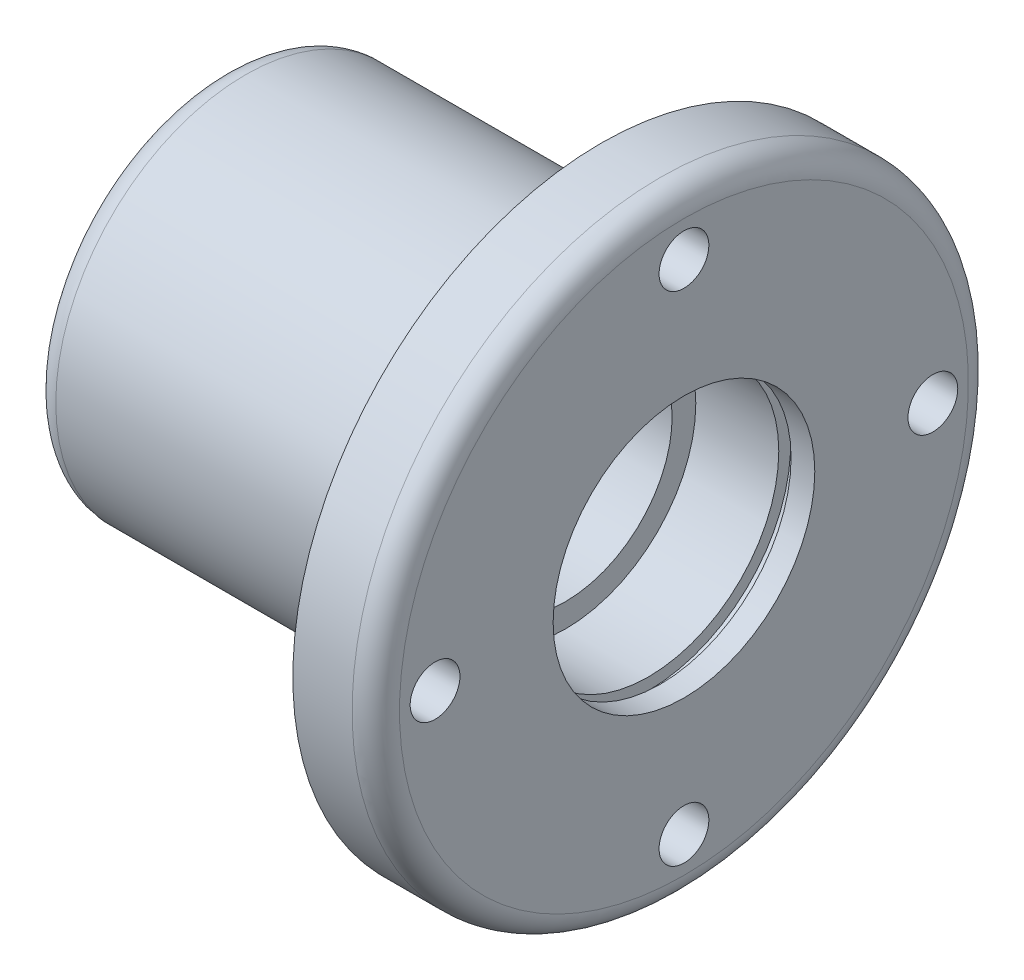
ISO-10303-21;
HEADER;
FILE_DESCRIPTION(('STEP AP214'),'2;1');
FILE_NAME('part.step','',(''),(''),'','','');
FILE_SCHEMA(('AUTOMOTIVE_DESIGN { 1 0 10303 214 1 1 1 1 }'));
ENDSEC;
DATA;
#1=APPLICATION_CONTEXT('core data for automotive mechanical design processes');
#2=APPLICATION_PROTOCOL_DEFINITION('international standard','automotive_design',2000,#1);
#3=PRODUCT_CONTEXT('',#1,'mechanical');
#4=PRODUCT('Part','Part','',(#3));
#5=PRODUCT_RELATED_PRODUCT_CATEGORY('part','',(#4));
#6=PRODUCT_DEFINITION_FORMATION('','',#4);
#7=PRODUCT_DEFINITION_CONTEXT('part definition',#1,'design');
#8=PRODUCT_DEFINITION('design','',#6,#7);
#9=PRODUCT_DEFINITION_SHAPE('','',#8);
#10=(LENGTH_UNIT() NAMED_UNIT(*) SI_UNIT(.MILLI.,.METRE.));
#11=(NAMED_UNIT(*) PLANE_ANGLE_UNIT() SI_UNIT($,.RADIAN.));
#12=(NAMED_UNIT(*) SI_UNIT($,.STERADIAN.) SOLID_ANGLE_UNIT());
#13=UNCERTAINTY_MEASURE_WITH_UNIT(LENGTH_MEASURE(1.E-05),#10,'distance_accuracy_value','');
#14=(GEOMETRIC_REPRESENTATION_CONTEXT(3) GLOBAL_UNCERTAINTY_ASSIGNED_CONTEXT((#13)) GLOBAL_UNIT_ASSIGNED_CONTEXT((#10,
#11,#12)) REPRESENTATION_CONTEXT('',''));
#15=CARTESIAN_POINT('',(0.,0.,0.));
#16=DIRECTION('',(0.,0.,1.));
#17=DIRECTION('',(1.,0.,0.));
#18=AXIS2_PLACEMENT_3D('',#15,#16,#17);
#19=CARTESIAN_POINT('',(-70.7,16.,0.));
#20=DIRECTION('',(1.,0.,0.));
#21=DIRECTION('',(0.,1.,0.));
#22=AXIS2_PLACEMENT_3D('',#19,#20,#21);
#23=PLANE('',#22);
#24=CARTESIAN_POINT('',(-70.7,0.,0.));
#25=DIRECTION('',(1.,0.,0.));
#26=DIRECTION('',(0.,1.,0.));
#27=AXIS2_PLACEMENT_3D('',#24,#25,#26);
#28=CIRCLE('',#27,14.);
#29=CARTESIAN_POINT('',(-70.7,14.,0.));
#30=VERTEX_POINT('',#29);
#31=EDGE_CURVE('E47',#30,#30,#28,.F.);
#32=ORIENTED_EDGE('',*,*,#31,.T.);
#33=EDGE_LOOP('',(#32));
#34=FACE_BOUND('',#33,.T.);
#35=CARTESIAN_POINT('',(-70.7,0.,0.));
#36=DIRECTION('',(-1.,0.,0.));
#37=DIRECTION('',(0.,-1.,0.));
#38=AXIS2_PLACEMENT_3D('',#35,#36,#37);
#39=CIRCLE('',#38,11.);
#40=CARTESIAN_POINT('',(-70.7,-11.,0.));
#41=VERTEX_POINT('',#40);
#42=EDGE_CURVE('E63',#41,#41,#39,.T.);
#43=ORIENTED_EDGE('',*,*,#42,.F.);
#44=EDGE_LOOP('',(#43));
#45=FACE_BOUND('',#44,.T.);
#46=ADVANCED_FACE('F39',(#34,#45),#23,.F.);
#47=CARTESIAN_POINT('',(-70.7,0.,0.));
#48=DIRECTION('',(-1.,0.,0.));
#49=DIRECTION('',(0.,-1.,0.));
#50=AXIS2_PLACEMENT_3D('',#47,#48,#49);
#51=CYLINDRICAL_SURFACE('',#50,11.);
#52=CARTESIAN_POINT('',(-68.7,0.,0.));
#53=DIRECTION('',(-1.,0.,0.));
#54=DIRECTION('',(0.,-1.,0.));
#55=AXIS2_PLACEMENT_3D('',#52,#53,#54);
#56=CIRCLE('',#55,11.);
#57=CARTESIAN_POINT('',(-68.7,-11.,0.));
#58=VERTEX_POINT('',#57);
#59=EDGE_CURVE('E85',#58,#58,#56,.T.);
#60=ORIENTED_EDGE('',*,*,#59,.F.);
#61=EDGE_LOOP('',(#60));
#62=FACE_BOUND('',#61,.T.);
#63=ORIENTED_EDGE('',*,*,#42,.T.);
#64=EDGE_LOOP('',(#63));
#65=FACE_BOUND('',#64,.T.);
#66=ADVANCED_FACE('F246',(#62,#65),#51,.F.);
#67=CARTESIAN_POINT('',(-68.7,11.,0.));
#68=DIRECTION('',(-1.,0.,0.));
#69=DIRECTION('',(0.,-1.,0.));
#70=AXIS2_PLACEMENT_3D('',#67,#68,#69);
#71=PLANE('',#70);
#72=CARTESIAN_POINT('',(-68.7,0.,0.));
#73=DIRECTION('',(-1.,0.,0.));
#74=DIRECTION('',(0.,-1.,0.));
#75=AXIS2_PLACEMENT_3D('',#72,#73,#74);
#76=CIRCLE('',#75,12.);
#77=CARTESIAN_POINT('',(-68.7,-12.,0.));
#78=VERTEX_POINT('',#77);
#79=EDGE_CURVE('E89',#78,#78,#76,.T.);
#80=ORIENTED_EDGE('',*,*,#79,.F.);
#81=EDGE_LOOP('',(#80));
#82=FACE_BOUND('',#81,.T.);
#83=ORIENTED_EDGE('',*,*,#59,.T.);
#84=EDGE_LOOP('',(#83));
#85=FACE_BOUND('',#84,.T.);
#86=ADVANCED_FACE('F240',(#82,#85),#71,.F.);
#87=CARTESIAN_POINT('',(-70.7,0.,0.));
#88=DIRECTION('',(-1.,0.,0.));
#89=DIRECTION('',(0.,-1.,0.));
#90=AXIS2_PLACEMENT_3D('',#87,#88,#89);
#91=CYLINDRICAL_SURFACE('',#90,12.);
#92=CARTESIAN_POINT('',(-67.7,0.,0.));
#93=DIRECTION('',(-1.,0.,0.));
#94=DIRECTION('',(0.,-1.,0.));
#95=AXIS2_PLACEMENT_3D('',#92,#93,#94);
#96=CIRCLE('',#95,12.);
#97=CARTESIAN_POINT('',(-67.7,-12.,0.));
#98=VERTEX_POINT('',#97);
#99=EDGE_CURVE('E93',#98,#98,#96,.T.);
#100=ORIENTED_EDGE('',*,*,#99,.F.);
#101=EDGE_LOOP('',(#100));
#102=FACE_BOUND('',#101,.T.);
#103=ORIENTED_EDGE('',*,*,#79,.T.);
#104=EDGE_LOOP('',(#103));
#105=FACE_BOUND('',#104,.T.);
#106=ADVANCED_FACE('F234',(#102,#105),#91,.F.);
#107=CARTESIAN_POINT('',(-67.7,12.,0.));
#108=DIRECTION('',(1.,0.,0.));
#109=DIRECTION('',(0.,1.,0.));
#110=AXIS2_PLACEMENT_3D('',#107,#108,#109);
#111=PLANE('',#110);
#112=CARTESIAN_POINT('',(-67.7,0.,0.));
#113=DIRECTION('',(-1.,0.,0.));
#114=DIRECTION('',(0.,-1.,0.));
#115=AXIS2_PLACEMENT_3D('',#112,#113,#114);
#116=CIRCLE('',#115,11.);
#117=CARTESIAN_POINT('',(-67.7,-11.,0.));
#118=VERTEX_POINT('',#117);
#119=EDGE_CURVE('E97',#118,#118,#116,.T.);
#120=ORIENTED_EDGE('',*,*,#119,.F.);
#121=EDGE_LOOP('',(#120));
#122=FACE_BOUND('',#121,.T.);
#123=ORIENTED_EDGE('',*,*,#99,.T.);
#124=EDGE_LOOP('',(#123));
#125=FACE_BOUND('',#124,.T.);
#126=ADVANCED_FACE('F228',(#122,#125),#111,.F.);
#127=CARTESIAN_POINT('',(-70.7,0.,0.));
#128=DIRECTION('',(-1.,0.,0.));
#129=DIRECTION('',(0.,-1.,0.));
#130=AXIS2_PLACEMENT_3D('',#127,#128,#129);
#131=CYLINDRICAL_SURFACE('',#130,11.);
#132=CARTESIAN_POINT('',(-60.7,0.,0.));
#133=DIRECTION('',(-1.,0.,0.));
#134=DIRECTION('',(0.,-1.,0.));
#135=AXIS2_PLACEMENT_3D('',#132,#133,#134);
#136=CIRCLE('',#135,11.);
#137=CARTESIAN_POINT('',(-60.7,-11.,0.));
#138=VERTEX_POINT('',#137);
#139=EDGE_CURVE('E101',#138,#138,#136,.T.);
#140=ORIENTED_EDGE('',*,*,#139,.F.);
#141=EDGE_LOOP('',(#140));
#142=FACE_BOUND('',#141,.T.);
#143=ORIENTED_EDGE('',*,*,#119,.T.);
#144=EDGE_LOOP('',(#143));
#145=FACE_BOUND('',#144,.T.);
#146=ADVANCED_FACE('F222',(#142,#145),#131,.F.);
#147=CARTESIAN_POINT('',(-60.7,11.,0.));
#148=DIRECTION('',(1.,0.,0.));
#149=DIRECTION('',(0.,1.,0.));
#150=AXIS2_PLACEMENT_3D('',#147,#148,#149);
#151=PLANE('',#150);
#152=CARTESIAN_POINT('',(-60.7,0.,0.));
#153=DIRECTION('',(-1.,0.,0.));
#154=DIRECTION('',(0.,-1.,0.));
#155=AXIS2_PLACEMENT_3D('',#152,#153,#154);
#156=CIRCLE('',#155,9.);
#157=CARTESIAN_POINT('',(-60.7,-9.,0.));
#158=VERTEX_POINT('',#157);
#159=EDGE_CURVE('E105',#158,#158,#156,.T.);
#160=ORIENTED_EDGE('',*,*,#159,.F.);
#161=EDGE_LOOP('',(#160));
#162=FACE_BOUND('',#161,.T.);
#163=ORIENTED_EDGE('',*,*,#139,.T.);
#164=EDGE_LOOP('',(#163));
#165=FACE_BOUND('',#164,.T.);
#166=ADVANCED_FACE('F216',(#162,#165),#151,.F.);
#167=CARTESIAN_POINT('',(-70.7,0.,0.));
#168=DIRECTION('',(-1.,0.,0.));
#169=DIRECTION('',(0.,-1.,0.));
#170=AXIS2_PLACEMENT_3D('',#167,#168,#169);
#171=CYLINDRICAL_SURFACE('',#170,9.);
#172=CARTESIAN_POINT('',(-41.7,0.,0.));
#173=DIRECTION('',(-1.,0.,0.));
#174=DIRECTION('',(0.,-1.,0.));
#175=AXIS2_PLACEMENT_3D('',#172,#173,#174);
#176=CIRCLE('',#175,9.);
#177=CARTESIAN_POINT('',(-41.7,-9.,0.));
#178=VERTEX_POINT('',#177);
#179=EDGE_CURVE('E109',#178,#178,#176,.T.);
#180=ORIENTED_EDGE('',*,*,#179,.F.);
#181=EDGE_LOOP('',(#180));
#182=FACE_BOUND('',#181,.T.);
#183=ORIENTED_EDGE('',*,*,#159,.T.);
#184=EDGE_LOOP('',(#183));
#185=FACE_BOUND('',#184,.T.);
#186=ADVANCED_FACE('F210',(#182,#185),#171,.F.);
#187=CARTESIAN_POINT('',(-41.7,9.,0.));
#188=DIRECTION('',(-1.,0.,0.));
#189=DIRECTION('',(0.,-1.,0.));
#190=AXIS2_PLACEMENT_3D('',#187,#188,#189);
#191=PLANE('',#190);
#192=CARTESIAN_POINT('',(-41.7,0.,0.));
#193=DIRECTION('',(-1.,0.,0.));
#194=DIRECTION('',(0.,-1.,0.));
#195=AXIS2_PLACEMENT_3D('',#192,#193,#194);
#196=CIRCLE('',#195,11.);
#197=CARTESIAN_POINT('',(-41.7,-11.,0.));
#198=VERTEX_POINT('',#197);
#199=EDGE_CURVE('E113',#198,#198,#196,.T.);
#200=ORIENTED_EDGE('',*,*,#199,.F.);
#201=EDGE_LOOP('',(#200));
#202=FACE_BOUND('',#201,.T.);
#203=ORIENTED_EDGE('',*,*,#179,.T.);
#204=EDGE_LOOP('',(#203));
#205=FACE_BOUND('',#204,.T.);
#206=ADVANCED_FACE('F204',(#202,#205),#191,.F.);
#207=CARTESIAN_POINT('',(-70.7,0.,0.));
#208=DIRECTION('',(-1.,0.,0.));
#209=DIRECTION('',(0.,-1.,0.));
#210=AXIS2_PLACEMENT_3D('',#207,#208,#209);
#211=CYLINDRICAL_SURFACE('',#210,11.);
#212=CARTESIAN_POINT('',(-34.7,0.,0.));
#213=DIRECTION('',(-1.,0.,0.));
#214=DIRECTION('',(0.,-1.,0.));
#215=AXIS2_PLACEMENT_3D('',#212,#213,#214);
#216=CIRCLE('',#215,11.);
#217=CARTESIAN_POINT('',(-34.7,-11.,0.));
#218=VERTEX_POINT('',#217);
#219=EDGE_CURVE('E117',#218,#218,#216,.T.);
#220=ORIENTED_EDGE('',*,*,#219,.F.);
#221=EDGE_LOOP('',(#220));
#222=FACE_BOUND('',#221,.T.);
#223=ORIENTED_EDGE('',*,*,#199,.T.);
#224=EDGE_LOOP('',(#223));
#225=FACE_BOUND('',#224,.T.);
#226=ADVANCED_FACE('F198',(#222,#225),#211,.F.);
#227=CARTESIAN_POINT('',(-34.7,11.,0.));
#228=DIRECTION('',(-1.,0.,0.));
#229=DIRECTION('',(0.,-1.,0.));
#230=AXIS2_PLACEMENT_3D('',#227,#228,#229);
#231=PLANE('',#230);
#232=CARTESIAN_POINT('',(-34.7,0.,0.));
#233=DIRECTION('',(-1.,0.,0.));
#234=DIRECTION('',(0.,-1.,0.));
#235=AXIS2_PLACEMENT_3D('',#232,#233,#234);
#236=CIRCLE('',#235,12.);
#237=CARTESIAN_POINT('',(-34.7,-12.,0.));
#238=VERTEX_POINT('',#237);
#239=EDGE_CURVE('E121',#238,#238,#236,.T.);
#240=ORIENTED_EDGE('',*,*,#239,.F.);
#241=EDGE_LOOP('',(#240));
#242=FACE_BOUND('',#241,.T.);
#243=ORIENTED_EDGE('',*,*,#219,.T.);
#244=EDGE_LOOP('',(#243));
#245=FACE_BOUND('',#244,.T.);
#246=ADVANCED_FACE('F192',(#242,#245),#231,.F.);
#247=CARTESIAN_POINT('',(-70.7,0.,0.));
#248=DIRECTION('',(-1.,0.,0.));
#249=DIRECTION('',(0.,-1.,0.));
#250=AXIS2_PLACEMENT_3D('',#247,#248,#249);
#251=CYLINDRICAL_SURFACE('',#250,12.);
#252=CARTESIAN_POINT('',(-33.7,0.,0.));
#253=DIRECTION('',(-1.,0.,0.));
#254=DIRECTION('',(0.,-1.,0.));
#255=AXIS2_PLACEMENT_3D('',#252,#253,#254);
#256=CIRCLE('',#255,12.);
#257=CARTESIAN_POINT('',(-33.7,-12.,0.));
#258=VERTEX_POINT('',#257);
#259=EDGE_CURVE('E125',#258,#258,#256,.T.);
#260=ORIENTED_EDGE('',*,*,#259,.F.);
#261=EDGE_LOOP('',(#260));
#262=FACE_BOUND('',#261,.T.);
#263=ORIENTED_EDGE('',*,*,#239,.T.);
#264=EDGE_LOOP('',(#263));
#265=FACE_BOUND('',#264,.T.);
#266=ADVANCED_FACE('F186',(#262,#265),#251,.F.);
#267=CARTESIAN_POINT('',(-33.7,12.,0.));
#268=DIRECTION('',(1.,0.,0.));
#269=DIRECTION('',(0.,1.,0.));
#270=AXIS2_PLACEMENT_3D('',#267,#268,#269);
#271=PLANE('',#270);
#272=CARTESIAN_POINT('',(-33.7,0.,0.));
#273=DIRECTION('',(-1.,0.,0.));
#274=DIRECTION('',(0.,-1.,0.));
#275=AXIS2_PLACEMENT_3D('',#272,#273,#274);
#276=CIRCLE('',#275,11.0385186031843);
#277=CARTESIAN_POINT('',(-33.7,-11.0385186031843,0.));
#278=VERTEX_POINT('',#277);
#279=EDGE_CURVE('E129',#278,#278,#276,.T.);
#280=ORIENTED_EDGE('',*,*,#279,.F.);
#281=EDGE_LOOP('',(#280));
#282=FACE_BOUND('',#281,.T.);
#283=ORIENTED_EDGE('',*,*,#259,.T.);
#284=EDGE_LOOP('',(#283));
#285=FACE_BOUND('',#284,.T.);
#286=ADVANCED_FACE('F180',(#282,#285),#271,.F.);
#287=CARTESIAN_POINT('',(-70.7,0.,0.));
#288=DIRECTION('',(-1.,0.,0.));
#289=DIRECTION('',(0.,-1.,0.));
#290=AXIS2_PLACEMENT_3D('',#287,#288,#289);
#291=CYLINDRICAL_SURFACE('',#290,11.0385186031843);
#292=CARTESIAN_POINT('',(-31.7,0.,0.));
#293=DIRECTION('',(-1.,0.,0.));
#294=DIRECTION('',(0.,-1.,0.));
#295=AXIS2_PLACEMENT_3D('',#292,#293,#294);
#296=CIRCLE('',#295,11.0385186031843);
#297=CARTESIAN_POINT('',(-31.7,-11.0385186031843,0.));
#298=VERTEX_POINT('',#297);
#299=EDGE_CURVE('E133',#298,#298,#296,.T.);
#300=ORIENTED_EDGE('',*,*,#299,.F.);
#301=EDGE_LOOP('',(#300));
#302=FACE_BOUND('',#301,.T.);
#303=ORIENTED_EDGE('',*,*,#279,.T.);
#304=EDGE_LOOP('',(#303));
#305=FACE_BOUND('',#304,.T.);
#306=ADVANCED_FACE('F167',(#302,#305),#291,.F.);
#307=CARTESIAN_POINT('',(-31.7,11.0385186031843,0.));
#308=DIRECTION('',(-1.,0.,0.));
#309=DIRECTION('',(0.,-1.,0.));
#310=AXIS2_PLACEMENT_3D('',#307,#308,#309);
#311=PLANE('',#310);
#312=CARTESIAN_POINT('',(-31.7,0.,0.));
#313=DIRECTION('',(-1.,0.,0.));
#314=DIRECTION('',(0.,-1.,0.));
#315=AXIS2_PLACEMENT_3D('',#312,#313,#314);
#316=CIRCLE('',#315,24.);
#317=CARTESIAN_POINT('',(-31.7,-24.,0.));
#318=VERTEX_POINT('',#317);
#319=EDGE_CURVE('E52',#318,#318,#316,.F.);
#320=ORIENTED_EDGE('',*,*,#319,.T.);
#321=EDGE_LOOP('',(#320));
#322=FACE_BOUND('',#321,.T.);
#323=CARTESIAN_POINT('',(-31.7,21.,0.));
#324=DIRECTION('',(1.,0.,0.));
#325=DIRECTION('',(0.,0.,-1.));
#326=AXIS2_PLACEMENT_3D('',#323,#324,#325);
#327=CIRCLE('',#326,2.1);
#328=CARTESIAN_POINT('',(-31.7,21.,-2.1));
#329=VERTEX_POINT('',#328);
#330=EDGE_CURVE('E81',#329,#329,#327,.T.);
#331=ORIENTED_EDGE('',*,*,#330,.F.);
#332=EDGE_LOOP('',(#331));
#333=FACE_BOUND('',#332,.T.);
#334=CARTESIAN_POINT('',(-31.7,5.66046088972391E-13,-21.0000000000006));
#335=DIRECTION('',(1.,0.,0.));
#336=DIRECTION('',(0.,0.,-1.));
#337=AXIS2_PLACEMENT_3D('',#334,#335,#336);
#338=CIRCLE('',#337,2.1);
#339=CARTESIAN_POINT('',(-31.7,5.66046088972391E-13,-23.1000000000006));
#340=VERTEX_POINT('',#339);
#341=EDGE_CURVE('E152',#340,#340,#338,.T.);
#342=ORIENTED_EDGE('',*,*,#341,.F.);
#343=EDGE_LOOP('',(#342));
#344=FACE_BOUND('',#343,.T.);
#345=CARTESIAN_POINT('',(-31.7,-21.,-1.13209225469949E-12));
#346=DIRECTION('',(1.,0.,0.));
#347=DIRECTION('',(0.,0.,-1.));
#348=AXIS2_PLACEMENT_3D('',#345,#346,#347);
#349=CIRCLE('',#348,2.1);
#350=CARTESIAN_POINT('',(-31.7,-21.,-2.10000000000113));
#351=VERTEX_POINT('',#350);
#352=EDGE_CURVE('E148',#351,#351,#349,.T.);
#353=ORIENTED_EDGE('',*,*,#352,.F.);
#354=EDGE_LOOP('',(#353));
#355=FACE_BOUND('',#354,.T.);
#356=CARTESIAN_POINT('',(-31.7,-5.68617924005304E-13,20.9999999999994));
#357=DIRECTION('',(1.,0.,0.));
#358=DIRECTION('',(0.,0.,-1.));
#359=AXIS2_PLACEMENT_3D('',#356,#357,#358);
#360=CIRCLE('',#359,2.1);
#361=CARTESIAN_POINT('',(-31.7,-5.68617924005304E-13,18.8999999999994));
#362=VERTEX_POINT('',#361);
#363=EDGE_CURVE('E144',#362,#362,#360,.T.);
#364=ORIENTED_EDGE('',*,*,#363,.F.);
#365=EDGE_LOOP('',(#364));
#366=FACE_BOUND('',#365,.T.);
#367=ORIENTED_EDGE('',*,*,#299,.T.);
#368=EDGE_LOOP('',(#367));
#369=FACE_BOUND('',#368,.T.);
#370=ADVANCED_FACE('F163',(#322,#333,#344,#355,#366,#369),#311,.F.);
#371=CARTESIAN_POINT('',(-70.7,0.,0.));
#372=DIRECTION('',(-1.,0.,0.));
#373=DIRECTION('',(0.,-1.,0.));
#374=AXIS2_PLACEMENT_3D('',#371,#372,#373);
#375=CYLINDRICAL_SURFACE('',#374,26.);
#376=CARTESIAN_POINT('',(-33.7,0.,0.));
#377=DIRECTION('',(-1.,0.,0.));
#378=DIRECTION('',(0.,-1.,0.));
#379=AXIS2_PLACEMENT_3D('',#376,#377,#378);
#380=CIRCLE('',#379,26.);
#381=CARTESIAN_POINT('',(-33.7,-26.,0.));
#382=VERTEX_POINT('',#381);
#383=EDGE_CURVE('E57',#382,#382,#380,.T.);
#384=ORIENTED_EDGE('',*,*,#383,.T.);
#385=EDGE_LOOP('',(#384));
#386=FACE_BOUND('',#385,.T.);
#387=CARTESIAN_POINT('',(-38.7,0.,0.));
#388=DIRECTION('',(-1.,0.,0.));
#389=DIRECTION('',(0.,-1.,0.));
#390=AXIS2_PLACEMENT_3D('',#387,#388,#389);
#391=CIRCLE('',#390,26.);
#392=CARTESIAN_POINT('',(-38.7,-26.,0.));
#393=VERTEX_POINT('',#392);
#394=EDGE_CURVE('E137',#393,#393,#391,.T.);
#395=ORIENTED_EDGE('',*,*,#394,.F.);
#396=EDGE_LOOP('',(#395));
#397=FACE_BOUND('',#396,.T.);
#398=ADVANCED_FACE('F166',(#386,#397),#375,.T.);
#399=CARTESIAN_POINT('',(-38.7,26.,0.));
#400=DIRECTION('',(1.,0.,0.));
#401=DIRECTION('',(0.,1.,0.));
#402=AXIS2_PLACEMENT_3D('',#399,#400,#401);
#403=PLANE('',#402);
#404=CARTESIAN_POINT('',(-38.7,21.,0.));
#405=DIRECTION('',(1.,0.,0.));
#406=DIRECTION('',(0.,1.,0.));
#407=AXIS2_PLACEMENT_3D('',#404,#405,#406);
#408=CIRCLE('',#407,2.1);
#409=CARTESIAN_POINT('',(-38.7,23.1,0.));
#410=VERTEX_POINT('',#409);
#411=EDGE_CURVE('E64',#410,#410,#408,.T.);
#412=ORIENTED_EDGE('',*,*,#411,.T.);
#413=EDGE_LOOP('',(#412));
#414=FACE_BOUND('',#413,.T.);
#415=CARTESIAN_POINT('',(-38.7,5.66046088972391E-13,-21.0000000000006));
#416=DIRECTION('',(1.,0.,0.));
#417=DIRECTION('',(0.,1.,0.));
#418=AXIS2_PLACEMENT_3D('',#415,#416,#417);
#419=CIRCLE('',#418,2.1);
#420=CARTESIAN_POINT('',(-38.7,2.10000000000057,-21.0000000000006));
#421=VERTEX_POINT('',#420);
#422=EDGE_CURVE('E69',#421,#421,#419,.T.);
#423=ORIENTED_EDGE('',*,*,#422,.T.);
#424=EDGE_LOOP('',(#423));
#425=FACE_BOUND('',#424,.T.);
#426=CARTESIAN_POINT('',(-38.7,-21.,-1.13209225469949E-12));
#427=DIRECTION('',(1.,0.,0.));
#428=DIRECTION('',(0.,1.,0.));
#429=AXIS2_PLACEMENT_3D('',#426,#427,#428);
#430=CIRCLE('',#429,2.1);
#431=CARTESIAN_POINT('',(-38.7,-18.9,-1.13209225469949E-12));
#432=VERTEX_POINT('',#431);
#433=EDGE_CURVE('E73',#432,#432,#430,.T.);
#434=ORIENTED_EDGE('',*,*,#433,.T.);
#435=EDGE_LOOP('',(#434));
#436=FACE_BOUND('',#435,.T.);
#437=CARTESIAN_POINT('',(-38.7,-5.68617924005304E-13,20.9999999999994));
#438=DIRECTION('',(1.,0.,0.));
#439=DIRECTION('',(0.,1.,0.));
#440=AXIS2_PLACEMENT_3D('',#437,#438,#439);
#441=CIRCLE('',#440,2.1);
#442=CARTESIAN_POINT('',(-38.7,2.09999999999943,20.9999999999994));
#443=VERTEX_POINT('',#442);
#444=EDGE_CURVE('E77',#443,#443,#441,.T.);
#445=ORIENTED_EDGE('',*,*,#444,.T.);
#446=EDGE_LOOP('',(#445));
#447=FACE_BOUND('',#446,.T.);
#448=CARTESIAN_POINT('',(-38.7,0.,0.));
#449=DIRECTION('',(-1.,0.,0.));
#450=DIRECTION('',(0.,-1.,0.));
#451=AXIS2_PLACEMENT_3D('',#448,#449,#450);
#452=CIRCLE('',#451,16.);
#453=CARTESIAN_POINT('',(-38.7,-16.,0.));
#454=VERTEX_POINT('',#453);
#455=EDGE_CURVE('E68',#454,#454,#452,.T.);
#456=ORIENTED_EDGE('',*,*,#455,.F.);
#457=EDGE_LOOP('',(#456));
#458=FACE_BOUND('',#457,.T.);
#459=ORIENTED_EDGE('',*,*,#394,.T.);
#460=EDGE_LOOP('',(#459));
#461=FACE_BOUND('',#460,.T.);
#462=ADVANCED_FACE('F275',(#414,#425,#436,#447,#458,#461),#403,.F.);
#463=CARTESIAN_POINT('',(-70.7,0.,0.));
#464=DIRECTION('',(-1.,0.,0.));
#465=DIRECTION('',(0.,-1.,0.));
#466=AXIS2_PLACEMENT_3D('',#463,#464,#465);
#467=CYLINDRICAL_SURFACE('',#466,16.);
#468=CARTESIAN_POINT('',(-68.7,0.,0.));
#469=DIRECTION('',(1.,0.,0.));
#470=DIRECTION('',(0.,1.,0.));
#471=AXIS2_PLACEMENT_3D('',#468,#469,#470);
#472=CIRCLE('',#471,16.);
#473=CARTESIAN_POINT('',(-68.7,16.,0.));
#474=VERTEX_POINT('',#473);
#475=EDGE_CURVE('E10',#474,#474,#472,.T.);
#476=ORIENTED_EDGE('',*,*,#475,.T.);
#477=EDGE_LOOP('',(#476));
#478=FACE_BOUND('',#477,.T.);
#479=ORIENTED_EDGE('',*,*,#455,.T.);
#480=EDGE_LOOP('',(#479));
#481=FACE_BOUND('',#480,.T.);
#482=ADVANCED_FACE('F280',(#478,#481),#467,.T.);
#483=CARTESIAN_POINT('',(-70.7,-5.68617924005304E-13,20.9999999999994));
#484=DIRECTION('',(1.,0.,0.));
#485=DIRECTION('',(0.,0.,-1.));
#486=AXIS2_PLACEMENT_3D('',#483,#484,#485);
#487=CYLINDRICAL_SURFACE('',#486,2.1);
#488=ORIENTED_EDGE('',*,*,#363,.T.);
#489=EDGE_LOOP('',(#488));
#490=FACE_BOUND('',#489,.T.);
#491=ORIENTED_EDGE('',*,*,#444,.F.);
#492=EDGE_LOOP('',(#491));
#493=FACE_BOUND('',#492,.T.);
#494=ADVANCED_FACE('F286',(#490,#493),#487,.F.);
#495=CARTESIAN_POINT('',(-70.7,-21.,-1.13209225469949E-12));
#496=DIRECTION('',(1.,0.,0.));
#497=DIRECTION('',(0.,0.,-1.));
#498=AXIS2_PLACEMENT_3D('',#495,#496,#497);
#499=CYLINDRICAL_SURFACE('',#498,2.1);
#500=ORIENTED_EDGE('',*,*,#352,.T.);
#501=EDGE_LOOP('',(#500));
#502=FACE_BOUND('',#501,.T.);
#503=ORIENTED_EDGE('',*,*,#433,.F.);
#504=EDGE_LOOP('',(#503));
#505=FACE_BOUND('',#504,.T.);
#506=ADVANCED_FACE('F292',(#502,#505),#499,.F.);
#507=CARTESIAN_POINT('',(-70.7,5.66046088972391E-13,-21.0000000000006));
#508=DIRECTION('',(1.,0.,0.));
#509=DIRECTION('',(0.,0.,-1.));
#510=AXIS2_PLACEMENT_3D('',#507,#508,#509);
#511=CYLINDRICAL_SURFACE('',#510,2.1);
#512=ORIENTED_EDGE('',*,*,#341,.T.);
#513=EDGE_LOOP('',(#512));
#514=FACE_BOUND('',#513,.T.);
#515=ORIENTED_EDGE('',*,*,#422,.F.);
#516=EDGE_LOOP('',(#515));
#517=FACE_BOUND('',#516,.T.);
#518=ADVANCED_FACE('F267',(#514,#517),#511,.F.);
#519=CARTESIAN_POINT('',(-70.7,21.,0.));
#520=DIRECTION('',(1.,0.,0.));
#521=DIRECTION('',(0.,0.,-1.));
#522=AXIS2_PLACEMENT_3D('',#519,#520,#521);
#523=CYLINDRICAL_SURFACE('',#522,2.1);
#524=ORIENTED_EDGE('',*,*,#330,.T.);
#525=EDGE_LOOP('',(#524));
#526=FACE_BOUND('',#525,.T.);
#527=ORIENTED_EDGE('',*,*,#411,.F.);
#528=EDGE_LOOP('',(#527));
#529=FACE_BOUND('',#528,.T.);
#530=ADVANCED_FACE('F160',(#526,#529),#523,.F.);
#531=CARTESIAN_POINT('',(-33.7,0.,0.));
#532=DIRECTION('',(-1.,0.,0.));
#533=DIRECTION('',(0.,-1.,0.));
#534=AXIS2_PLACEMENT_3D('',#531,#532,#533);
#535=TOROIDAL_SURFACE('',#534,24.,2.);
#536=ORIENTED_EDGE('',*,*,#319,.F.);
#537=EDGE_LOOP('',(#536));
#538=FACE_BOUND('',#537,.T.);
#539=ORIENTED_EDGE('',*,*,#383,.F.);
#540=EDGE_LOOP('',(#539));
#541=FACE_BOUND('',#540,.T.);
#542=ADVANCED_FACE('F259',(#538,#541),#535,.T.);
#543=CARTESIAN_POINT('',(-68.7,0.,0.));
#544=DIRECTION('',(1.,0.,0.));
#545=DIRECTION('',(0.,1.,0.));
#546=AXIS2_PLACEMENT_3D('',#543,#544,#545);
#547=TOROIDAL_SURFACE('',#546,14.,2.);
#548=ORIENTED_EDGE('',*,*,#475,.F.);
#549=EDGE_LOOP('',(#548));
#550=FACE_BOUND('',#549,.T.);
#551=ORIENTED_EDGE('',*,*,#31,.F.);
#552=EDGE_LOOP('',(#551));
#553=FACE_BOUND('',#552,.T.);
#554=ADVANCED_FACE('F41',(#550,#553),#547,.T.);
#555=CLOSED_SHELL('',(#46,#66,#86,#106,#126,#146,#166,#186,#206,#226,#246,#266,#286,#306,#370,
#398,#462,#482,#494,#506,#518,#530,#542,#554));
#556=MANIFOLD_SOLID_BREP('B2',#555);
#557=ADVANCED_BREP_SHAPE_REPRESENTATION('',(#18,#556),#14);
#558=SHAPE_DEFINITION_REPRESENTATION(#9,#557);
ENDSEC;
END-ISO-10303-21;
